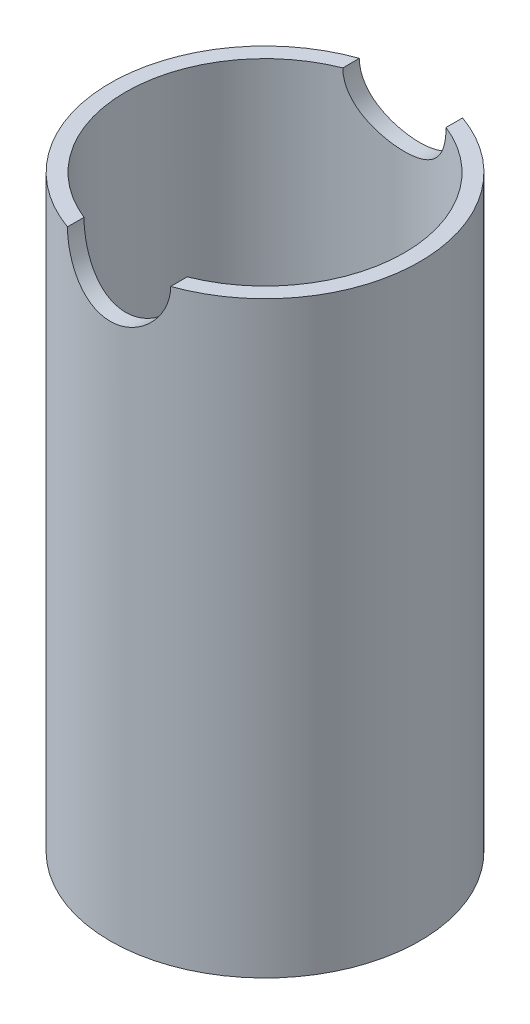
ISO-10303-21;
HEADER;
FILE_DESCRIPTION(('STEP AP214'),'2;1');
FILE_NAME('part.step','',(''),(''),'','','');
FILE_SCHEMA(('AUTOMOTIVE_DESIGN { 1 0 10303 214 1 1 1 1 }'));
ENDSEC;
DATA;
#1=APPLICATION_CONTEXT('core data for automotive mechanical design processes');
#2=APPLICATION_PROTOCOL_DEFINITION('international standard','automotive_design',2000,#1);
#3=PRODUCT_CONTEXT('',#1,'mechanical');
#4=PRODUCT('Part','Part','',(#3));
#5=PRODUCT_RELATED_PRODUCT_CATEGORY('part','',(#4));
#6=PRODUCT_DEFINITION_FORMATION('','',#4);
#7=PRODUCT_DEFINITION_CONTEXT('part definition',#1,'design');
#8=PRODUCT_DEFINITION('design','',#6,#7);
#9=PRODUCT_DEFINITION_SHAPE('','',#8);
#10=(LENGTH_UNIT() NAMED_UNIT(*) SI_UNIT(.MILLI.,.METRE.));
#11=(NAMED_UNIT(*) PLANE_ANGLE_UNIT() SI_UNIT($,.RADIAN.));
#12=(NAMED_UNIT(*) SI_UNIT($,.STERADIAN.) SOLID_ANGLE_UNIT());
#13=UNCERTAINTY_MEASURE_WITH_UNIT(LENGTH_MEASURE(1.E-05),#10,'distance_accuracy_value','');
#14=(GEOMETRIC_REPRESENTATION_CONTEXT(3) GLOBAL_UNCERTAINTY_ASSIGNED_CONTEXT((#13)) GLOBAL_UNIT_ASSIGNED_CONTEXT((#10,
#11,#12)) REPRESENTATION_CONTEXT('',''));
#15=CARTESIAN_POINT('',(0.,0.,0.));
#16=DIRECTION('',(0.,0.,1.));
#17=DIRECTION('',(1.,0.,0.));
#18=AXIS2_PLACEMENT_3D('',#15,#16,#17);
#19=CARTESIAN_POINT('',(0.,57.,0.));
#20=DIRECTION('',(0.,1.,0.));
#21=DIRECTION('',(0.,0.,1.));
#22=AXIS2_PLACEMENT_3D('',#19,#20,#21);
#23=PLANE('',#22);
#24=DIRECTION('',(0.,0.,1.));
#25=VECTOR('',#24,1.);
#26=CARTESIAN_POINT('',(-5.,57.,-42.));
#27=LINE('',#26,#25);
#28=CARTESIAN_POINT('',(-5.,57.,-14.1421356237309));
#29=VERTEX_POINT('',#28);
#30=CARTESIAN_POINT('',(-5.,57.,-12.5399362039844));
#31=VERTEX_POINT('',#30);
#32=EDGE_CURVE('E11',#29,#31,#27,.T.);
#33=ORIENTED_EDGE('',*,*,#32,.F.);
#34=CARTESIAN_POINT('',(0.,57.,0.));
#35=DIRECTION('',(0.,1.,0.));
#36=DIRECTION('',(0.,0.,1.));
#37=AXIS2_PLACEMENT_3D('',#34,#35,#36);
#38=CIRCLE('',#37,15.);
#39=CARTESIAN_POINT('',(-5.,57.,14.1421356237309));
#40=VERTEX_POINT('',#39);
#41=EDGE_CURVE('E87',#29,#40,#38,.T.);
#42=ORIENTED_EDGE('',*,*,#41,.T.);
#43=CARTESIAN_POINT('',(-5.,57.,12.5399362039844));
#44=VERTEX_POINT('',#43);
#45=EDGE_CURVE('E38',#44,#40,#27,.T.);
#46=ORIENTED_EDGE('',*,*,#45,.F.);
#47=CARTESIAN_POINT('',(0.,57.,0.));
#48=DIRECTION('',(0.,1.,0.));
#49=DIRECTION('',(0.,0.,1.));
#50=AXIS2_PLACEMENT_3D('',#47,#48,#49);
#51=CIRCLE('',#50,13.5);
#52=EDGE_CURVE('E163',#31,#44,#51,.T.);
#53=ORIENTED_EDGE('',*,*,#52,.F.);
#54=EDGE_LOOP('',(#33,#42,#46,#53));
#55=FACE_BOUND('',#54,.T.);
#56=ADVANCED_FACE('F33',(#55),#23,.T.);
#57=CARTESIAN_POINT('',(0.,2.,0.));
#58=DIRECTION('',(0.,-1.,0.));
#59=DIRECTION('',(0.,0.,-1.));
#60=AXIS2_PLACEMENT_3D('',#57,#58,#59);
#61=CYLINDRICAL_SURFACE('',#60,15.);
#62=CARTESIAN_POINT('',(0.,0.,0.));
#63=DIRECTION('',(0.,1.,0.));
#64=DIRECTION('',(0.,0.,1.));
#65=AXIS2_PLACEMENT_3D('',#62,#63,#64);
#66=CIRCLE('',#65,15.);
#67=CARTESIAN_POINT('',(0.,0.,15.));
#68=VERTEX_POINT('',#67);
#69=EDGE_CURVE('E91',#68,#68,#66,.T.);
#70=ORIENTED_EDGE('',*,*,#69,.T.);
#71=EDGE_LOOP('',(#70));
#72=FACE_BOUND('',#71,.T.);
#73=CARTESIAN_POINT('',(5.,57.,14.1421356237309));
#74=VERTEX_POINT('',#73);
#75=CARTESIAN_POINT('',(5.,57.,-14.1421356237309));
#76=VERTEX_POINT('',#75);
#77=EDGE_CURVE('E85',#74,#76,#38,.T.);
#78=ORIENTED_EDGE('',*,*,#77,.F.);
#79=CARTESIAN_POINT('',(5.,57.,14.1421356237309));
#80=CARTESIAN_POINT('',(5.00001928272081,56.8635881720931,14.1421132795953));
#81=CARTESIAN_POINT('',(4.99441839460028,56.727185014359,14.144108585197));
#82=CARTESIAN_POINT('',(4.97212026561631,56.4554367599058,14.1519707752355));
#83=CARTESIAN_POINT('',(4.95542602013328,56.3200913875465,14.1578366145644));
#84=CARTESIAN_POINT('',(4.91115048442878,56.051821342899,14.1732535212275));
#85=CARTESIAN_POINT('',(4.88360148534076,55.9188907030971,14.182793656248));
#86=CARTESIAN_POINT('',(4.81787909036062,55.6559753543424,14.2052544389481));
#87=CARTESIAN_POINT('',(4.77970531049258,55.525990752042,14.2181752088016));
#88=CARTESIAN_POINT('',(4.69309505128876,55.2699410016701,14.2469974292543));
#89=CARTESIAN_POINT('',(4.64466686529954,55.1438727801068,14.2628964699579));
#90=CARTESIAN_POINT('',(4.53792631398361,54.8963314520598,14.2972152683245));
#91=CARTESIAN_POINT('',(4.47961026060572,54.7748600808984,14.3156359660384));
#92=CARTESIAN_POINT('',(4.29042487291366,54.4184310715872,14.3739242294785));
#93=CARTESIAN_POINT('',(4.14528130436108,54.1913498163612,14.4168308914588));
#94=CARTESIAN_POINT('',(3.81524041281298,53.756362129662,14.5077282855086));
#95=CARTESIAN_POINT('',(3.62912046165332,53.5494157510172,14.5558450324036));
#96=CARTESIAN_POINT('',(3.22494665570402,53.1689797594628,14.6506912904573));
#97=CARTESIAN_POINT('',(3.006887126647,52.9954961041316,14.6974205533429));
#98=CARTESIAN_POINT('',(2.53801699448499,52.682599665868,14.7856944680589));
#99=CARTESIAN_POINT('',(2.28650011670831,52.5441943437394,14.8270719634014));
#100=CARTESIAN_POINT('',(1.76214657981255,52.3120394755885,14.8984803449503));
#101=CARTESIAN_POINT('',(1.4893164631573,52.2182762881127,14.9285146967399));
#102=CARTESIAN_POINT('',(0.940146645163374,52.0813211791884,14.9729535792742));
#103=CARTESIAN_POINT('',(0.664259156539236,52.0364835729023,14.9878654569488));
#104=CARTESIAN_POINT('',(0.108494863035941,51.9934185716859,15.0021804126725));
#105=CARTESIAN_POINT('',(-0.171380975391806,51.9951800706124,15.0015871861129));
#106=CARTESIAN_POINT('',(-0.715519207983842,52.0442213511986,14.9853019394036));
#107=CARTESIAN_POINT('',(-0.97996342637404,52.0897129968732,14.9702030725849));
#108=CARTESIAN_POINT('',(-1.49722040864173,52.2219661863054,14.9273480020182));
#109=CARTESIAN_POINT('',(-1.75003252671059,52.30873001845,14.8995910964333));
#110=CARTESIAN_POINT('',(-2.24076278220401,52.5221061312796,14.8337834991293));
#111=CARTESIAN_POINT('',(-2.47844127676376,52.6492275379066,14.7956022127902));
#112=CARTESIAN_POINT('',(-2.9296241973344,52.9393024453905,14.7129190630403));
#113=CARTESIAN_POINT('',(-3.14312202351085,53.1022656933306,14.6684154814678));
#114=CARTESIAN_POINT('',(-3.55048180391262,53.4683447401301,14.5753148518701));
#115=CARTESIAN_POINT('',(-3.74294939170373,53.6729876378473,14.5266237190253));
#116=CARTESIAN_POINT('',(-4.09137879648192,54.1122475417086,14.4323697370697));
#117=CARTESIAN_POINT('',(-4.24732881968224,54.3468741937544,14.3868079019513));
#118=CARTESIAN_POINT('',(-4.45137197181612,54.7183911879691,14.3244699574743));
#119=CARTESIAN_POINT('',(-4.51477947987293,54.8465692559587,14.3045606178995));
#120=CARTESIAN_POINT('',(-4.63050119526385,55.108206226196,14.2675208843929));
#121=CARTESIAN_POINT('',(-4.68282002045479,55.2416629025947,14.2503893343581));
#122=CARTESIAN_POINT('',(-4.77584283639463,55.5127713582079,14.2194841629367));
#123=CARTESIAN_POINT('',(-4.81655946314397,55.65041839138,14.2057068907929));
#124=CARTESIAN_POINT('',(-4.88604801985988,55.9289601930593,14.1819560641116));
#125=CARTESIAN_POINT('',(-4.91482540411389,56.0698534474523,14.1719807728584));
#126=CARTESIAN_POINT('',(-4.9582745368723,56.3420530581884,14.1568366544479));
#127=CARTESIAN_POINT('',(-4.97391718926364,56.4731868994733,14.1513381564974));
#128=CARTESIAN_POINT('',(-4.99478118687353,56.7362104158748,14.143980412972));
#129=CARTESIAN_POINT('',(-5.00001597952916,56.8680988945849,14.1421164714419));
#130=CARTESIAN_POINT('',(-5.,57.,14.142135623731));
#131=B_SPLINE_CURVE_WITH_KNOTS('',3,(#79,#80,#81,#82,#83,#84,#85,#86,#87,#88,#89,#90,#91,#92,
#93,#94,#95,#96,#97,#98,#99,#100,#101,#102,#103,#104,#105,#106,#107,#108,#109,#110,#111,#112,
#113,#114,#115,#116,#117,#118,#119,#120,#121,#122,#123,#124,#125,#126,#127,#128,#129,#130),
.UNSPECIFIED.,.F.,.F.,(4,2,2,2,2,2,2,2,2,2,2,2,2,2,2,2,2,2,2,2,2,2,2,2,2,4),(0.,
0.409092423677161,0.818074430847312,1.22584885885815,1.63363802561078,2.04109864022585,
2.44871156823776,3.26359482908313,4.10724851154046,4.95105225659394,5.81687991006163,
6.68244281946293,7.51789679977671,8.35315166493869,9.15564418669333,9.95818120881897,
10.771274204705,11.584588592845,12.4361259663091,13.2879379758687,13.7206337000479,
14.1531488734623,14.5851911765746,15.0170358888757,15.4131122811713,15.8086765909866),.UNSPECIFIED.);
#132=EDGE_CURVE('E49',#74,#40,#131,.T.);
#133=ORIENTED_EDGE('',*,*,#132,.T.);
#134=ORIENTED_EDGE('',*,*,#41,.F.);
#135=CARTESIAN_POINT('',(-5.,57.,-14.1421356237309));
#136=CARTESIAN_POINT('',(-5.00001928272081,56.8635881720931,-14.1421132795953));
#137=CARTESIAN_POINT('',(-4.99441839460028,56.727185014359,-14.144108585197));
#138=CARTESIAN_POINT('',(-4.97212026561631,56.4554367599058,-14.1519707752355));
#139=CARTESIAN_POINT('',(-4.95542602013328,56.3200913875465,-14.1578366145644));
#140=CARTESIAN_POINT('',(-4.91115048442878,56.051821342899,-14.1732535212275));
#141=CARTESIAN_POINT('',(-4.88360148534076,55.9188907030971,-14.182793656248));
#142=CARTESIAN_POINT('',(-4.81787909036062,55.6559753543424,-14.2052544389481));
#143=CARTESIAN_POINT('',(-4.77970531049258,55.525990752042,-14.2181752088016));
#144=CARTESIAN_POINT('',(-4.69309505128876,55.2699410016701,-14.2469974292543));
#145=CARTESIAN_POINT('',(-4.64466686529954,55.1438727801068,-14.2628964699579));
#146=CARTESIAN_POINT('',(-4.53792631398361,54.8963314520598,-14.2972152683245));
#147=CARTESIAN_POINT('',(-4.47961026060572,54.7748600808984,-14.3156359660384));
#148=CARTESIAN_POINT('',(-4.29042487291366,54.4184310715872,-14.3739242294785));
#149=CARTESIAN_POINT('',(-4.14528130436108,54.1913498163612,-14.4168308914588));
#150=CARTESIAN_POINT('',(-3.81524041281298,53.756362129662,-14.5077282855086));
#151=CARTESIAN_POINT('',(-3.62912046165332,53.5494157510172,-14.5558450324036));
#152=CARTESIAN_POINT('',(-3.22494665570402,53.1689797594628,-14.6506912904573));
#153=CARTESIAN_POINT('',(-3.006887126647,52.9954961041316,-14.6974205533429));
#154=CARTESIAN_POINT('',(-2.53801699448499,52.682599665868,-14.7856944680589));
#155=CARTESIAN_POINT('',(-2.28650011670831,52.5441943437394,-14.8270719634014));
#156=CARTESIAN_POINT('',(-1.76214657981255,52.3120394755885,-14.8984803449503));
#157=CARTESIAN_POINT('',(-1.4893164631573,52.2182762881127,-14.9285146967399));
#158=CARTESIAN_POINT('',(-0.940146645163372,52.0813211791884,-14.9729535792742));
#159=CARTESIAN_POINT('',(-0.664259156539234,52.0364835729023,-14.9878654569488));
#160=CARTESIAN_POINT('',(-0.10849486303594,51.9934185716859,-15.0021804126725));
#161=CARTESIAN_POINT('',(0.171380975391807,51.9951800706124,-15.0015871861129));
#162=CARTESIAN_POINT('',(0.715519207983842,52.0442213511986,-14.9853019394036));
#163=CARTESIAN_POINT('',(0.97996342637404,52.0897129968732,-14.9702030725849));
#164=CARTESIAN_POINT('',(1.49722040864173,52.2219661863054,-14.9273480020182));
#165=CARTESIAN_POINT('',(1.75003252671059,52.30873001845,-14.8995910964333));
#166=CARTESIAN_POINT('',(2.24076278220401,52.5221061312796,-14.8337834991293));
#167=CARTESIAN_POINT('',(2.47844127676376,52.6492275379066,-14.7956022127902));
#168=CARTESIAN_POINT('',(2.9296241973344,52.9393024453905,-14.7129190630403));
#169=CARTESIAN_POINT('',(3.14312202351085,53.1022656933306,-14.6684154814678));
#170=CARTESIAN_POINT('',(3.55048180391261,53.4683447401301,-14.5753148518701));
#171=CARTESIAN_POINT('',(3.74294939170373,53.6729876378473,-14.5266237190253));
#172=CARTESIAN_POINT('',(4.09137879648191,54.1122475417086,-14.4323697370697));
#173=CARTESIAN_POINT('',(4.24732881968224,54.3468741937544,-14.3868079019513));
#174=CARTESIAN_POINT('',(4.45137197181611,54.718391187969,-14.3244699574743));
#175=CARTESIAN_POINT('',(4.51477947987293,54.8465692559587,-14.3045606178995));
#176=CARTESIAN_POINT('',(4.63050119526384,55.108206226196,-14.2675208843929));
#177=CARTESIAN_POINT('',(4.68282002045478,55.2416629025947,-14.2503893343581));
#178=CARTESIAN_POINT('',(4.77584283639462,55.5127713582079,-14.2194841629367));
#179=CARTESIAN_POINT('',(4.81655946314397,55.65041839138,-14.2057068907929));
#180=CARTESIAN_POINT('',(4.88604801985988,55.9289601930593,-14.1819560641116));
#181=CARTESIAN_POINT('',(4.91482540411389,56.0698534474523,-14.1719807728584));
#182=CARTESIAN_POINT('',(4.9582745368723,56.3420530581884,-14.1568366544479));
#183=CARTESIAN_POINT('',(4.97391718926364,56.4731868994733,-14.1513381564974));
#184=CARTESIAN_POINT('',(4.99478118687353,56.7362104158748,-14.143980412972));
#185=CARTESIAN_POINT('',(5.00001597952916,56.8680988945849,-14.1421164714419));
#186=CARTESIAN_POINT('',(5.,57.,-14.142135623731));
#187=B_SPLINE_CURVE_WITH_KNOTS('',3,(#135,#136,#137,#138,#139,#140,#141,#142,#143,#144,#145,
#146,#147,#148,#149,#150,#151,#152,#153,#154,#155,#156,#157,#158,#159,#160,#161,#162,#163,#164,
#165,#166,#167,#168,#169,#170,#171,#172,#173,#174,#175,#176,#177,#178,#179,#180,#181,#182,#183,
#184,#185,#186),.UNSPECIFIED.,.F.,.F.,(4,2,2,2,2,2,2,2,2,2,2,2,2,2,2,2,2,2,2,2,2,2,2,2,2,4),(0.,
0.409092423677161,0.818074430847312,1.22584885885815,1.63363802561078,2.04109864022585,
2.44871156823776,3.26359482908313,4.10724851154046,4.95105225659394,5.81687991006163,
6.68244281946293,7.51789679977671,8.35315166493869,9.15564418669333,9.95818120881897,
10.771274204705,11.584588592845,12.4361259663091,13.2879379758687,13.7206337000479,
14.1531488734623,14.5851911765746,15.0170358888757,15.4131122811713,15.8086765909866),.UNSPECIFIED.);
#188=EDGE_CURVE('E74',#29,#76,#187,.T.);
#189=ORIENTED_EDGE('',*,*,#188,.T.);
#190=EDGE_LOOP('',(#78,#133,#134,#189));
#191=FACE_BOUND('',#190,.T.);
#192=ADVANCED_FACE('F35',(#72,#191),#61,.T.);
#193=CARTESIAN_POINT('',(0.,2.,0.));
#194=DIRECTION('',(0.,-1.,0.));
#195=DIRECTION('',(0.,0.,-1.));
#196=AXIS2_PLACEMENT_3D('',#193,#194,#195);
#197=CYLINDRICAL_SURFACE('',#196,3.6);
#198=CARTESIAN_POINT('',(0.,2.,0.));
#199=DIRECTION('',(0.,1.,0.));
#200=DIRECTION('',(0.,0.,1.));
#201=AXIS2_PLACEMENT_3D('',#198,#199,#200);
#202=CIRCLE('',#201,3.6);
#203=CARTESIAN_POINT('',(0.,2.,3.6));
#204=VERTEX_POINT('',#203);
#205=EDGE_CURVE('E102',#204,#204,#202,.T.);
#206=ORIENTED_EDGE('',*,*,#205,.T.);
#207=EDGE_LOOP('',(#206));
#208=FACE_BOUND('',#207,.T.);
#209=CARTESIAN_POINT('',(0.,0.,0.));
#210=DIRECTION('',(0.,1.,0.));
#211=DIRECTION('',(0.,0.,1.));
#212=AXIS2_PLACEMENT_3D('',#209,#210,#211);
#213=CIRCLE('',#212,3.6);
#214=CARTESIAN_POINT('',(0.,0.,3.6));
#215=VERTEX_POINT('',#214);
#216=EDGE_CURVE('E94',#215,#215,#213,.T.);
#217=ORIENTED_EDGE('',*,*,#216,.F.);
#218=EDGE_LOOP('',(#217));
#219=FACE_BOUND('',#218,.T.);
#220=ADVANCED_FACE('F111',(#208,#219),#197,.F.);
#221=CARTESIAN_POINT('',(0.,2.,0.));
#222=DIRECTION('',(0.,1.,0.));
#223=DIRECTION('',(0.,0.,1.));
#224=AXIS2_PLACEMENT_3D('',#221,#222,#223);
#225=PLANE('',#224);
#226=CARTESIAN_POINT('',(0.,2.,0.));
#227=DIRECTION('',(0.,1.,0.));
#228=DIRECTION('',(0.,0.,1.));
#229=AXIS2_PLACEMENT_3D('',#226,#227,#228);
#230=CIRCLE('',#229,13.5);
#231=CARTESIAN_POINT('',(0.,2.,13.5));
#232=VERTEX_POINT('',#231);
#233=EDGE_CURVE('E81',#232,#232,#230,.F.);
#234=ORIENTED_EDGE('',*,*,#233,.F.);
#235=EDGE_LOOP('',(#234));
#236=FACE_BOUND('',#235,.T.);
#237=ORIENTED_EDGE('',*,*,#205,.F.);
#238=EDGE_LOOP('',(#237));
#239=FACE_BOUND('',#238,.T.);
#240=ADVANCED_FACE('F113',(#236,#239),#225,.T.);
#241=CARTESIAN_POINT('',(0.,0.,0.));
#242=DIRECTION('',(0.,1.,0.));
#243=DIRECTION('',(0.,0.,1.));
#244=AXIS2_PLACEMENT_3D('',#241,#242,#243);
#245=PLANE('',#244);
#246=ORIENTED_EDGE('',*,*,#216,.T.);
#247=EDGE_LOOP('',(#246));
#248=FACE_BOUND('',#247,.T.);
#249=ORIENTED_EDGE('',*,*,#69,.F.);
#250=EDGE_LOOP('',(#249));
#251=FACE_BOUND('',#250,.T.);
#252=ADVANCED_FACE('F108',(#248,#251),#245,.F.);
#253=CARTESIAN_POINT('',(0.,57.,0.));
#254=DIRECTION('',(0.,-1.,0.));
#255=DIRECTION('',(0.,0.,-1.));
#256=AXIS2_PLACEMENT_3D('',#253,#254,#255);
#257=CYLINDRICAL_SURFACE('',#256,13.5);
#258=CARTESIAN_POINT('',(5.,57.,12.5399362039844));
#259=CARTESIAN_POINT('',(5.00002028137306,56.8645973060183,12.5399106643268));
#260=CARTESIAN_POINT('',(4.99450074487781,56.7292049174362,12.5421284263526));
#261=CARTESIAN_POINT('',(4.97253430352867,56.4594921910789,12.5508628713664));
#262=CARTESIAN_POINT('',(4.95609098160619,56.3251715164026,12.5573781447934));
#263=CARTESIAN_POINT('',(4.91250488810121,56.059026616202,12.5744903850377));
#264=CARTESIAN_POINT('',(4.88539948155275,55.9271953395638,12.5850730946822));
#265=CARTESIAN_POINT('',(4.82076234028634,55.6664749472863,12.6099744882652));
#266=CARTESIAN_POINT('',(4.78323009373786,55.5375859764147,12.6242933556013));
#267=CARTESIAN_POINT('',(4.69812183169468,55.2837404482611,12.6562122896476));
#268=CARTESIAN_POINT('',(4.65055671386149,55.1587797919219,12.6738087937975));
#269=CARTESIAN_POINT('',(4.54575934795455,54.9134000861373,12.7117731552553));
#270=CARTESIAN_POINT('',(4.48852347928528,54.7929827583828,12.7321420499504));
#271=CARTESIAN_POINT('',(4.30287776247547,54.4395381228977,12.7965784020534));
#272=CARTESIAN_POINT('',(4.16050986100023,54.2142590934618,12.8439833760415));
#273=CARTESIAN_POINT('',(3.8355293645435,53.7804512372062,12.9448399206643));
#274=CARTESIAN_POINT('',(3.6514271081532,53.5730883430383,12.9984653932782));
#275=CARTESIAN_POINT('',(3.25113101337243,53.1912574828146,13.1043063253727));
#276=CARTESIAN_POINT('',(3.0349310401698,53.0167958196492,13.1565215130466));
#277=CARTESIAN_POINT('',(2.68682391378835,52.7808069696627,13.2304865692202));
#278=CARTESIAN_POINT('',(2.56462266724757,52.705424502483,13.2547728019864));
#279=CARTESIAN_POINT('',(2.31384344979225,52.5652818049825,13.3008399451161));
#280=CARTESIAN_POINT('',(2.18526810125961,52.5005172527891,13.3226218737375));
#281=CARTESIAN_POINT('',(1.92258380363955,52.3821611705757,13.3630587952222));
#282=CARTESIAN_POINT('',(1.78847409896333,52.3285711722692,13.3817133593443));
#283=CARTESIAN_POINT('',(1.51576236575226,52.2331015715325,13.4153391165714));
#284=CARTESIAN_POINT('',(1.37716247523688,52.1912164846225,13.4303120343608));
#285=CARTESIAN_POINT('',(1.10235558171108,52.121057949394,13.4555955128804));
#286=CARTESIAN_POINT('',(0.966290494136305,52.0922889699702,13.4660747138124));
#287=CARTESIAN_POINT('',(0.692043133006585,52.0461731384857,13.4829499362094));
#288=CARTESIAN_POINT('',(0.553861784579604,52.0288214334033,13.4893476924962));
#289=CARTESIAN_POINT('',(0.276409259145593,52.0057056729329,13.49788354743));
#290=CARTESIAN_POINT('',(0.137138141088152,51.9999409950517,13.5000218749075));
#291=CARTESIAN_POINT('',(-0.141396320087891,52.0000599115491,13.4999777893151));
#292=CARTESIAN_POINT('',(-0.280659663314703,52.0059431637162,13.4977955031832));
#293=CARTESIAN_POINT('',(-0.55133883014931,52.0287257352512,13.4893833681056));
#294=CARTESIAN_POINT('',(-0.682807505295319,52.045076586812,13.4833550877757));
#295=CARTESIAN_POINT('',(-0.943859969575563,52.0881127365001,13.4675994951354));
#296=CARTESIAN_POINT('',(-1.07344311218532,52.1148014965775,13.4578709437011));
#297=CARTESIAN_POINT('',(-1.32976187028168,52.1782625388688,13.4349646417581));
#298=CARTESIAN_POINT('',(-1.45649844255931,52.2150313763776,13.4217880696252));
#299=CARTESIAN_POINT('',(-1.70636518424174,52.2983309843428,13.3923181751971));
#300=CARTESIAN_POINT('',(-1.82949396767653,52.3448654517583,13.3760236727587));
#301=CARTESIAN_POINT('',(-2.19569440993958,52.5000300618033,13.3225418192633));
#302=CARTESIAN_POINT('',(-2.43210965710146,52.623358703171,13.2810809829641));
#303=CARTESIAN_POINT('',(-2.88134517504036,52.9050890284625,13.1909268346116));
#304=CARTESIAN_POINT('',(-3.09415786566233,53.0635019313153,13.1422312107265));
#305=CARTESIAN_POINT('',(-3.50318768963734,53.4214958450275,13.0393494679212));
#306=CARTESIAN_POINT('',(-3.69776212488422,53.6229117605343,12.9850086116081));
#307=CARTESIAN_POINT('',(-4.051063236399,54.0560356800396,12.87916942678));
#308=CARTESIAN_POINT('',(-4.2097761728585,54.2877552409363,12.8276721934481));
#309=CARTESIAN_POINT('',(-4.41898582236957,54.6562465136703,12.7564944119021));
#310=CARTESIAN_POINT('',(-4.484469677397,54.7840975934013,12.7335612841275));
#311=CARTESIAN_POINT('',(-4.60434721919936,55.0453619805076,12.6907067962428));
#312=CARTESIAN_POINT('',(-4.65874561418929,55.1787728973886,12.670784158451));
#313=CARTESIAN_POINT('',(-4.75588922408565,55.4500773171562,12.6346431418197));
#314=CARTESIAN_POINT('',(-4.79864792106943,55.5879654250978,12.6184204809195));
#315=CARTESIAN_POINT('',(-4.8721434820044,55.8672765033872,12.5902247355962));
#316=CARTESIAN_POINT('',(-4.90288577828892,56.0086978456073,12.578249731134));
#317=CARTESIAN_POINT('',(-4.95155077945532,56.2912761609381,12.5591741389515));
#318=CARTESIAN_POINT('',(-4.96970598995318,56.4323870902087,12.5519852483993));
#319=CARTESIAN_POINT('',(-4.993936830426,56.7156612452568,12.5423531972495));
#320=CARTESIAN_POINT('',(-5.00002428204835,56.8578233041399,12.5399053923107));
#321=CARTESIAN_POINT('',(-5.,57.,12.5399362039845));
#322=B_SPLINE_CURVE_WITH_KNOTS('',3,(#258,#259,#260,#261,#262,#263,#264,#265,#266,#267,#268,
#269,#270,#271,#272,#273,#274,#275,#276,#277,#278,#279,#280,#281,#282,#283,#284,#285,#286,#287,
#288,#289,#290,#291,#292,#293,#294,#295,#296,#297,#298,#299,#300,#301,#302,#303,#304,#305,#306,
#307,#308,#309,#310,#311,#312,#313,#314,#315,#316,#317,#318,#319,#320,#321),.UNSPECIFIED.,.F.,
.F.,(4,2,2,2,2,2,2,2,2,2,2,2,2,2,2,2,2,2,2,2,2,2,2,2,2,2,2,2,2,2,2,4),(0.,0.406061325259203,
0.811989530727032,1.21650766560562,1.62104566089483,2.02514649090988,2.42939894728641,
3.23771755172334,4.08144249335124,4.92532890358527,5.3617383769139,5.79796977251945,
6.23426092379353,6.67034730140812,7.08821614090193,7.50590724631143,7.9235759113778,
8.34123230569003,8.73861976091924,9.13614040813579,9.53352537800973,9.93106105754196,
10.7367769030008,11.5427507659668,12.3947700734636,13.2471152682418,13.6830451207421,
14.1187894375135,14.5540268699893,14.9890673136162,15.4158408183213,15.8421960461999),.UNSPECIFIED.);
#323=CARTESIAN_POINT('',(5.,57.,12.5399362039845));
#324=VERTEX_POINT('',#323);
#325=EDGE_CURVE('E88',#324,#44,#322,.T.);
#326=ORIENTED_EDGE('',*,*,#325,.F.);
#327=CARTESIAN_POINT('',(5.,57.,-12.5399362039845));
#328=VERTEX_POINT('',#327);
#329=EDGE_CURVE('E96',#324,#328,#51,.T.);
#330=ORIENTED_EDGE('',*,*,#329,.T.);
#331=CARTESIAN_POINT('',(-5.,57.,-12.5399362039844));
#332=CARTESIAN_POINT('',(-5.00002028137306,56.8645973060183,-12.5399106643268));
#333=CARTESIAN_POINT('',(-4.99450074487781,56.7292049174362,-12.5421284263526));
#334=CARTESIAN_POINT('',(-4.97253430352867,56.4594921910789,-12.5508628713664));
#335=CARTESIAN_POINT('',(-4.95609098160619,56.3251715164026,-12.5573781447934));
#336=CARTESIAN_POINT('',(-4.9125048881012,56.059026616202,-12.5744903850377));
#337=CARTESIAN_POINT('',(-4.88539948155275,55.9271953395637,-12.5850730946822));
#338=CARTESIAN_POINT('',(-4.82076234028634,55.6664749472863,-12.6099744882652));
#339=CARTESIAN_POINT('',(-4.78323009373786,55.5375859764147,-12.6242933556013));
#340=CARTESIAN_POINT('',(-4.69812183169468,55.2837404482611,-12.6562122896476));
#341=CARTESIAN_POINT('',(-4.65055671386149,55.1587797919219,-12.6738087937975));
#342=CARTESIAN_POINT('',(-4.54575934795455,54.9134000861372,-12.7117731552553));
#343=CARTESIAN_POINT('',(-4.48852347928527,54.7929827583828,-12.7321420499504));
#344=CARTESIAN_POINT('',(-4.30287776247547,54.4395381228977,-12.7965784020534));
#345=CARTESIAN_POINT('',(-4.16050986100022,54.2142590934618,-12.8439833760415));
#346=CARTESIAN_POINT('',(-3.8355293645435,53.7804512372061,-12.9448399206643));
#347=CARTESIAN_POINT('',(-3.65142710815319,53.5730883430383,-12.9984653932782));
#348=CARTESIAN_POINT('',(-3.25113101337242,53.1912574828145,-13.1043063253727));
#349=CARTESIAN_POINT('',(-3.0349310401698,53.0167958196492,-13.1565215130466));
#350=CARTESIAN_POINT('',(-2.68682391378834,52.7808069696627,-13.2304865692202));
#351=CARTESIAN_POINT('',(-2.56462266724756,52.705424502483,-13.2547728019864));
#352=CARTESIAN_POINT('',(-2.31384344979224,52.5652818049824,-13.3008399451161));
#353=CARTESIAN_POINT('',(-2.1852681012596,52.5005172527891,-13.3226218737375));
#354=CARTESIAN_POINT('',(-1.92258380363954,52.3821611705757,-13.3630587952222));
#355=CARTESIAN_POINT('',(-1.78847409896332,52.3285711722692,-13.3817133593443));
#356=CARTESIAN_POINT('',(-1.51576236575225,52.2331015715325,-13.4153391165715));
#357=CARTESIAN_POINT('',(-1.37716247523687,52.1912164846225,-13.4303120343608));
#358=CARTESIAN_POINT('',(-1.10235558171106,52.1210579493939,-13.4555955128804));
#359=CARTESIAN_POINT('',(-0.966290494136293,52.0922889699702,-13.4660747138124));
#360=CARTESIAN_POINT('',(-0.692043133006574,52.0461731384857,-13.4829499362094));
#361=CARTESIAN_POINT('',(-0.553861784579593,52.0288214334033,-13.4893476924962));
#362=CARTESIAN_POINT('',(-0.276409259145583,52.0057056729329,-13.49788354743));
#363=CARTESIAN_POINT('',(-0.137138141088142,51.9999409950517,-13.5000218749075));
#364=CARTESIAN_POINT('',(0.1413963200879,52.0000599115491,-13.4999777893151));
#365=CARTESIAN_POINT('',(0.280659663314712,52.0059431637162,-13.4977955031832));
#366=CARTESIAN_POINT('',(0.551338830149318,52.0287257352512,-13.4893833681056));
#367=CARTESIAN_POINT('',(0.682807505295326,52.045076586812,-13.4833550877757));
#368=CARTESIAN_POINT('',(0.94385996957557,52.0881127365001,-13.4675994951354));
#369=CARTESIAN_POINT('',(1.07344311218533,52.1148014965775,-13.4578709437011));
#370=CARTESIAN_POINT('',(1.32976187028168,52.1782625388688,-13.4349646417581));
#371=CARTESIAN_POINT('',(1.45649844255932,52.2150313763776,-13.4217880696252));
#372=CARTESIAN_POINT('',(1.70636518424174,52.2983309843428,-13.3923181751971));
#373=CARTESIAN_POINT('',(1.82949396767653,52.3448654517583,-13.3760236727587));
#374=CARTESIAN_POINT('',(2.19569440993959,52.5000300618033,-13.3225418192633));
#375=CARTESIAN_POINT('',(2.43210965710147,52.623358703171,-13.2810809829641));
#376=CARTESIAN_POINT('',(2.88134517504036,52.9050890284625,-13.1909268346116));
#377=CARTESIAN_POINT('',(3.09415786566234,53.0635019313153,-13.1422312107265));
#378=CARTESIAN_POINT('',(3.50318768963734,53.4214958450275,-13.0393494679212));
#379=CARTESIAN_POINT('',(3.69776212488422,53.6229117605343,-12.9850086116081));
#380=CARTESIAN_POINT('',(4.05106323639901,54.0560356800396,-12.87916942678));
#381=CARTESIAN_POINT('',(4.2097761728585,54.2877552409363,-12.8276721934481));
#382=CARTESIAN_POINT('',(4.41898582236957,54.6562465136703,-12.7564944119021));
#383=CARTESIAN_POINT('',(4.484469677397,54.7840975934013,-12.7335612841275));
#384=CARTESIAN_POINT('',(4.60434721919936,55.0453619805076,-12.6907067962428));
#385=CARTESIAN_POINT('',(4.6587456141893,55.1787728973886,-12.670784158451));
#386=CARTESIAN_POINT('',(4.75588922408566,55.4500773171562,-12.6346431418197));
#387=CARTESIAN_POINT('',(4.79864792106943,55.5879654250978,-12.6184204809195));
#388=CARTESIAN_POINT('',(4.87214348200441,55.8672765033873,-12.5902247355962));
#389=CARTESIAN_POINT('',(4.90288577828892,56.0086978456073,-12.578249731134));
#390=CARTESIAN_POINT('',(4.95155077945533,56.2912761609381,-12.5591741389515));
#391=CARTESIAN_POINT('',(4.96970598995318,56.4323870902087,-12.5519852483993));
#392=CARTESIAN_POINT('',(4.993936830426,56.7156612452568,-12.5423531972495));
#393=CARTESIAN_POINT('',(5.00002428204835,56.8578233041399,-12.5399053923107));
#394=CARTESIAN_POINT('',(5.,57.,-12.5399362039845));
#395=B_SPLINE_CURVE_WITH_KNOTS('',3,(#331,#332,#333,#334,#335,#336,#337,#338,#339,#340,#341,
#342,#343,#344,#345,#346,#347,#348,#349,#350,#351,#352,#353,#354,#355,#356,#357,#358,#359,#360,
#361,#362,#363,#364,#365,#366,#367,#368,#369,#370,#371,#372,#373,#374,#375,#376,#377,#378,#379,
#380,#381,#382,#383,#384,#385,#386,#387,#388,#389,#390,#391,#392,#393,#394),.UNSPECIFIED.,.F.,
.F.,(4,2,2,2,2,2,2,2,2,2,2,2,2,2,2,2,2,2,2,2,2,2,2,2,2,2,2,2,2,2,2,4),(0.,0.406061325259203,
0.811989530727046,1.21650766560562,1.62104566089483,2.02514649090988,2.42939894728642,
3.23771755172335,4.08144249335125,4.92532890358528,5.36173837691391,5.79796977251946,
6.23426092379354,6.67034730140813,7.08821614090194,7.50590724631144,7.92357591137781,
8.34123230569004,8.73861976091925,9.1361404081358,9.53352537800974,9.93106105754197,
10.7367769030009,11.5427507659668,12.3947700734636,13.2471152682418,13.6830451207421,
14.1187894375135,14.5540268699893,14.9890673136162,15.4158408183213,15.8421960461999),.UNSPECIFIED.);
#396=EDGE_CURVE('E56',#31,#328,#395,.T.);
#397=ORIENTED_EDGE('',*,*,#396,.F.);
#398=ORIENTED_EDGE('',*,*,#52,.T.);
#399=EDGE_LOOP('',(#326,#330,#397,#398));
#400=FACE_BOUND('',#399,.T.);
#401=ORIENTED_EDGE('',*,*,#233,.T.);
#402=EDGE_LOOP('',(#401));
#403=FACE_BOUND('',#402,.T.);
#404=ADVANCED_FACE('F131',(#400,#403),#257,.F.);
#405=DIRECTION('',(0.,0.,1.));
#406=VECTOR('',#405,1.);
#407=CARTESIAN_POINT('',(5.,57.,-42.));
#408=LINE('',#407,#406);
#409=EDGE_CURVE('E80',#74,#324,#408,.F.);
#410=ORIENTED_EDGE('',*,*,#409,.F.);
#411=ORIENTED_EDGE('',*,*,#77,.T.);
#412=EDGE_CURVE('E71',#328,#76,#408,.F.);
#413=ORIENTED_EDGE('',*,*,#412,.F.);
#414=ORIENTED_EDGE('',*,*,#329,.F.);
#415=EDGE_LOOP('',(#410,#411,#413,#414));
#416=FACE_BOUND('',#415,.T.);
#417=ADVANCED_FACE('F90',(#416),#23,.T.);
#418=CARTESIAN_POINT('',(0.,57.,-42.));
#419=DIRECTION('',(0.,0.,1.));
#420=DIRECTION('',(1.,0.,0.));
#421=AXIS2_PLACEMENT_3D('',#418,#419,#420);
#422=CYLINDRICAL_SURFACE('',#421,5.);
#423=ORIENTED_EDGE('',*,*,#32,.T.);
#424=ORIENTED_EDGE('',*,*,#396,.T.);
#425=ORIENTED_EDGE('',*,*,#412,.T.);
#426=ORIENTED_EDGE('',*,*,#188,.F.);
#427=EDGE_LOOP('',(#423,#424,#425,#426));
#428=FACE_BOUND('',#427,.T.);
#429=ADVANCED_FACE('F73',(#428),#422,.F.);
#430=ORIENTED_EDGE('',*,*,#132,.F.);
#431=ORIENTED_EDGE('',*,*,#409,.T.);
#432=ORIENTED_EDGE('',*,*,#325,.T.);
#433=ORIENTED_EDGE('',*,*,#45,.T.);
#434=EDGE_LOOP('',(#430,#431,#432,#433));
#435=FACE_BOUND('',#434,.T.);
#436=ADVANCED_FACE('F136',(#435),#422,.F.);
#437=CLOSED_SHELL('',(#56,#192,#220,#240,#252,#404,#417,#429,#436));
#438=MANIFOLD_SOLID_BREP('B2',#437);
#439=ADVANCED_BREP_SHAPE_REPRESENTATION('',(#18,#438),#14);
#440=SHAPE_DEFINITION_REPRESENTATION(#9,#439);
ENDSEC;
END-ISO-10303-21;
